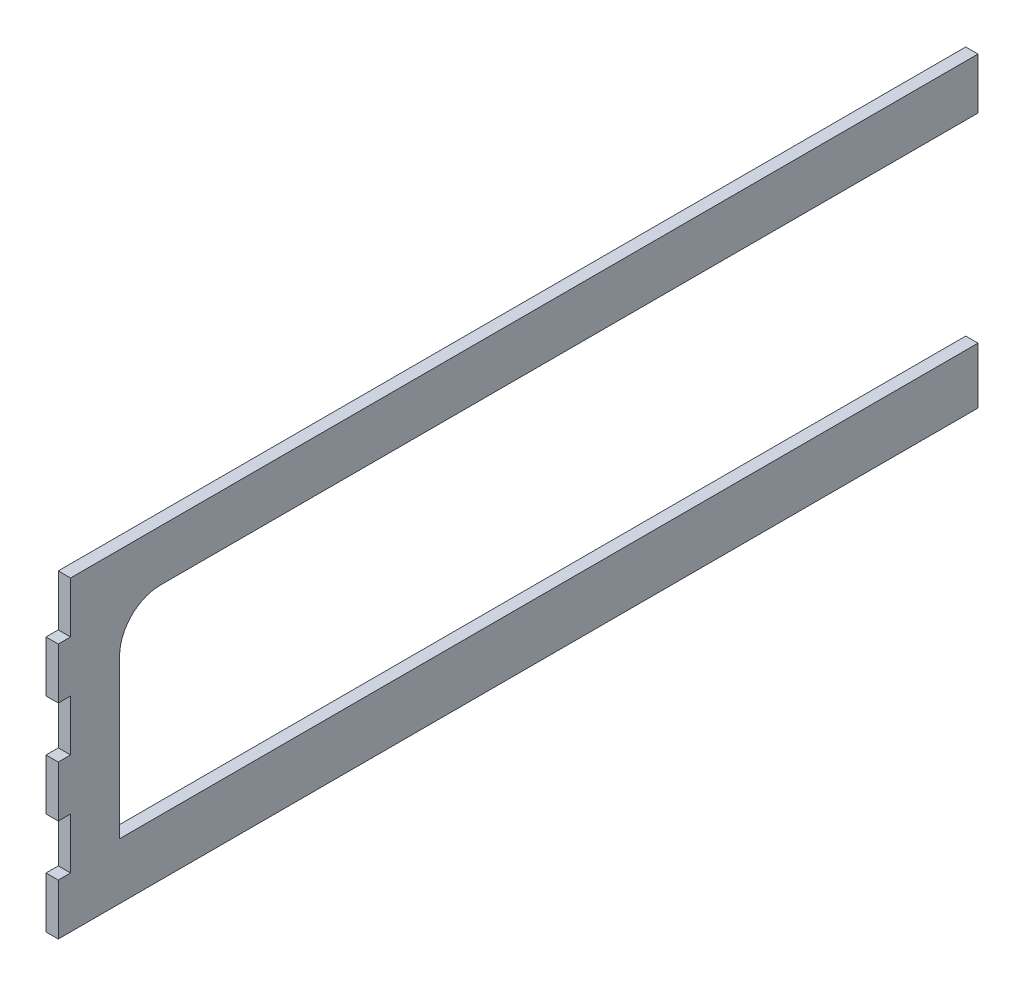
ISO-10303-21;
HEADER;
FILE_DESCRIPTION(('STEP AP214'),'2;1');
FILE_NAME('part.step','',(''),(''),'','','');
FILE_SCHEMA(('AUTOMOTIVE_DESIGN { 1 0 10303 214 1 1 1 1 }'));
ENDSEC;
DATA;
#1=APPLICATION_CONTEXT('core data for automotive mechanical design processes');
#2=APPLICATION_PROTOCOL_DEFINITION('international standard','automotive_design',2000,#1);
#3=PRODUCT_CONTEXT('',#1,'mechanical');
#4=PRODUCT('Part','Part','',(#3));
#5=PRODUCT_RELATED_PRODUCT_CATEGORY('part','',(#4));
#6=PRODUCT_DEFINITION_FORMATION('','',#4);
#7=PRODUCT_DEFINITION_CONTEXT('part definition',#1,'design');
#8=PRODUCT_DEFINITION('design','',#6,#7);
#9=PRODUCT_DEFINITION_SHAPE('','',#8);
#10=(LENGTH_UNIT() NAMED_UNIT(*) SI_UNIT(.MILLI.,.METRE.));
#11=(NAMED_UNIT(*) PLANE_ANGLE_UNIT() SI_UNIT($,.RADIAN.));
#12=(NAMED_UNIT(*) SI_UNIT($,.STERADIAN.) SOLID_ANGLE_UNIT());
#13=UNCERTAINTY_MEASURE_WITH_UNIT(LENGTH_MEASURE(1.E-05),#10,'distance_accuracy_value','');
#14=(GEOMETRIC_REPRESENTATION_CONTEXT(3) GLOBAL_UNCERTAINTY_ASSIGNED_CONTEXT((#13)) GLOBAL_UNIT_ASSIGNED_CONTEXT((#10,
#11,#12)) REPRESENTATION_CONTEXT('',''));
#15=CARTESIAN_POINT('',(0.,0.,0.));
#16=DIRECTION('',(0.,0.,1.));
#17=DIRECTION('',(1.,0.,0.));
#18=AXIS2_PLACEMENT_3D('',#15,#16,#17);
#19=CARTESIAN_POINT('',(6.,0.,0.));
#20=DIRECTION('',(0.,0.,-1.));
#21=DIRECTION('',(-1.,0.,0.));
#22=AXIS2_PLACEMENT_3D('',#19,#20,#21);
#23=PLANE('',#22);
#24=DIRECTION('',(0.,-1.,0.));
#25=VECTOR('',#24,1.);
#26=CARTESIAN_POINT('',(0.,0.,0.));
#27=LINE('',#26,#25);
#28=CARTESIAN_POINT('',(0.,125.,0.));
#29=VERTEX_POINT('',#28);
#30=CARTESIAN_POINT('',(0.,100.,0.));
#31=VERTEX_POINT('',#30);
#32=EDGE_CURVE('E207',#29,#31,#27,.T.);
#33=ORIENTED_EDGE('',*,*,#32,.T.);
#34=DIRECTION('',(1.,0.,0.));
#35=VECTOR('',#34,1.);
#36=CARTESIAN_POINT('',(0.,100.,0.));
#37=LINE('',#36,#35);
#38=CARTESIAN_POINT('',(6.,100.,0.));
#39=VERTEX_POINT('',#38);
#40=EDGE_CURVE('E319',#31,#39,#37,.T.);
#41=ORIENTED_EDGE('',*,*,#40,.T.);
#42=DIRECTION('',(0.,-1.,0.));
#43=VECTOR('',#42,1.);
#44=CARTESIAN_POINT('',(6.,0.,0.));
#45=LINE('',#44,#43);
#46=CARTESIAN_POINT('',(6.,125.,0.));
#47=VERTEX_POINT('',#46);
#48=EDGE_CURVE('E290',#47,#39,#45,.T.);
#49=ORIENTED_EDGE('',*,*,#48,.F.);
#50=DIRECTION('',(1.,0.,0.));
#51=VECTOR('',#50,1.);
#52=CARTESIAN_POINT('',(0.,125.,0.));
#53=LINE('',#52,#51);
#54=EDGE_CURVE('E301',#29,#47,#53,.T.);
#55=ORIENTED_EDGE('',*,*,#54,.F.);
#56=EDGE_LOOP('',(#33,#41,#49,#55));
#57=FACE_BOUND('',#56,.T.);
#58=ADVANCED_FACE('F44',(#57),#23,.F.);
#59=CARTESIAN_POINT('',(6.,75.,0.));
#60=VERTEX_POINT('',#59);
#61=CARTESIAN_POINT('',(6.,50.,0.));
#62=VERTEX_POINT('',#61);
#63=EDGE_CURVE('E196',#60,#62,#45,.T.);
#64=ORIENTED_EDGE('',*,*,#63,.F.);
#65=DIRECTION('',(1.,0.,0.));
#66=VECTOR('',#65,1.);
#67=CARTESIAN_POINT('',(0.,75.,0.));
#68=LINE('',#67,#66);
#69=CARTESIAN_POINT('',(0.,75.,0.));
#70=VERTEX_POINT('',#69);
#71=EDGE_CURVE('E180',#70,#60,#68,.T.);
#72=ORIENTED_EDGE('',*,*,#71,.F.);
#73=CARTESIAN_POINT('',(0.,50.,0.));
#74=VERTEX_POINT('',#73);
#75=EDGE_CURVE('E194',#70,#74,#27,.T.);
#76=ORIENTED_EDGE('',*,*,#75,.T.);
#77=DIRECTION('',(1.,0.,0.));
#78=VECTOR('',#77,1.);
#79=CARTESIAN_POINT('',(0.,50.,0.));
#80=LINE('',#79,#78);
#81=EDGE_CURVE('E335',#74,#62,#80,.T.);
#82=ORIENTED_EDGE('',*,*,#81,.T.);
#83=EDGE_LOOP('',(#64,#72,#76,#82));
#84=FACE_BOUND('',#83,.T.);
#85=ADVANCED_FACE('F192',(#84),#23,.F.);
#86=CARTESIAN_POINT('',(6.,25.,0.));
#87=VERTEX_POINT('',#86);
#88=CARTESIAN_POINT('',(6.,0.,0.));
#89=VERTEX_POINT('',#88);
#90=EDGE_CURVE('E240',#87,#89,#45,.T.);
#91=ORIENTED_EDGE('',*,*,#90,.F.);
#92=DIRECTION('',(1.,0.,0.));
#93=VECTOR('',#92,1.);
#94=CARTESIAN_POINT('',(0.,25.,0.));
#95=LINE('',#94,#93);
#96=CARTESIAN_POINT('',(0.,25.,0.));
#97=VERTEX_POINT('',#96);
#98=EDGE_CURVE('E326',#97,#87,#95,.T.);
#99=ORIENTED_EDGE('',*,*,#98,.F.);
#100=CARTESIAN_POINT('',(0.,0.,0.));
#101=VERTEX_POINT('',#100);
#102=EDGE_CURVE('E208',#97,#101,#27,.T.);
#103=ORIENTED_EDGE('',*,*,#102,.T.);
#104=DIRECTION('',(-1.,0.,0.));
#105=VECTOR('',#104,1.);
#106=CARTESIAN_POINT('',(6.,0.,0.));
#107=LINE('',#106,#105);
#108=EDGE_CURVE('E261',#89,#101,#107,.T.);
#109=ORIENTED_EDGE('',*,*,#108,.F.);
#110=EDGE_LOOP('',(#91,#99,#103,#109));
#111=FACE_BOUND('',#110,.T.);
#112=ADVANCED_FACE('F431',(#111),#23,.F.);
#113=CARTESIAN_POINT('',(6.,0.,0.));
#114=DIRECTION('',(0.,1.,0.));
#115=DIRECTION('',(0.,0.,1.));
#116=AXIS2_PLACEMENT_3D('',#113,#114,#115);
#117=PLANE('',#116);
#118=DIRECTION('',(0.,0.,-1.));
#119=VECTOR('',#118,1.);
#120=CARTESIAN_POINT('',(0.,0.,0.));
#121=LINE('',#120,#119);
#122=CARTESIAN_POINT('',(0.,0.,-450.));
#123=VERTEX_POINT('',#122);
#124=EDGE_CURVE('E213',#101,#123,#121,.T.);
#125=ORIENTED_EDGE('',*,*,#124,.T.);
#126=DIRECTION('',(-1.,0.,0.));
#127=VECTOR('',#126,1.);
#128=CARTESIAN_POINT('',(6.,0.,-450.));
#129=LINE('',#128,#127);
#130=CARTESIAN_POINT('',(6.,0.,-450.));
#131=VERTEX_POINT('',#130);
#132=EDGE_CURVE('E257',#131,#123,#129,.T.);
#133=ORIENTED_EDGE('',*,*,#132,.F.);
#134=DIRECTION('',(0.,0.,-1.));
#135=VECTOR('',#134,1.);
#136=CARTESIAN_POINT('',(6.,0.,0.));
#137=LINE('',#136,#135);
#138=EDGE_CURVE('E287',#89,#131,#137,.T.);
#139=ORIENTED_EDGE('',*,*,#138,.F.);
#140=ORIENTED_EDGE('',*,*,#108,.T.);
#141=EDGE_LOOP('',(#125,#133,#139,#140));
#142=FACE_BOUND('',#141,.T.);
#143=ADVANCED_FACE('F426',(#142),#117,.F.);
#144=CARTESIAN_POINT('',(6.,0.,-450.));
#145=DIRECTION('',(0.,0.,1.));
#146=DIRECTION('',(1.,0.,0.));
#147=AXIS2_PLACEMENT_3D('',#144,#145,#146);
#148=PLANE('',#147);
#149=DIRECTION('',(0.,1.,0.));
#150=VECTOR('',#149,1.);
#151=CARTESIAN_POINT('',(0.,0.,-450.));
#152=LINE('',#151,#150);
#153=CARTESIAN_POINT('',(0.,27.5,-450.));
#154=VERTEX_POINT('',#153);
#155=EDGE_CURVE('E221',#123,#154,#152,.T.);
#156=ORIENTED_EDGE('',*,*,#155,.T.);
#157=DIRECTION('',(-1.,0.,0.));
#158=VECTOR('',#157,1.);
#159=CARTESIAN_POINT('',(6.,27.5,-450.));
#160=LINE('',#159,#158);
#161=CARTESIAN_POINT('',(6.,27.5,-450.));
#162=VERTEX_POINT('',#161);
#163=EDGE_CURVE('E253',#162,#154,#160,.T.);
#164=ORIENTED_EDGE('',*,*,#163,.F.);
#165=DIRECTION('',(0.,1.,0.));
#166=VECTOR('',#165,1.);
#167=CARTESIAN_POINT('',(6.,0.,-450.));
#168=LINE('',#167,#166);
#169=EDGE_CURVE('E284',#131,#162,#168,.T.);
#170=ORIENTED_EDGE('',*,*,#169,.F.);
#171=ORIENTED_EDGE('',*,*,#132,.T.);
#172=EDGE_LOOP('',(#156,#164,#170,#171));
#173=FACE_BOUND('',#172,.T.);
#174=ADVANCED_FACE('F423',(#173),#148,.F.);
#175=CARTESIAN_POINT('',(6.,27.5,-450.));
#176=DIRECTION('',(0.,-1.,0.));
#177=DIRECTION('',(0.,0.,-1.));
#178=AXIS2_PLACEMENT_3D('',#175,#176,#177);
#179=PLANE('',#178);
#180=DIRECTION('',(0.,0.,1.));
#181=VECTOR('',#180,1.);
#182=CARTESIAN_POINT('',(0.,27.5,-450.));
#183=LINE('',#182,#181);
#184=CARTESIAN_POINT('',(0.,27.4999999999999,-30.));
#185=VERTEX_POINT('',#184);
#186=EDGE_CURVE('E224',#154,#185,#183,.T.);
#187=ORIENTED_EDGE('',*,*,#186,.T.);
#188=DIRECTION('',(-1.,0.,0.));
#189=VECTOR('',#188,1.);
#190=CARTESIAN_POINT('',(6.,27.4999999999999,-30.));
#191=LINE('',#190,#189);
#192=CARTESIAN_POINT('',(6.,27.4999999999999,-30.));
#193=VERTEX_POINT('',#192);
#194=EDGE_CURVE('E249',#193,#185,#191,.T.);
#195=ORIENTED_EDGE('',*,*,#194,.F.);
#196=DIRECTION('',(0.,0.,1.));
#197=VECTOR('',#196,1.);
#198=CARTESIAN_POINT('',(6.,27.5,-450.));
#199=LINE('',#198,#197);
#200=EDGE_CURVE('E281',#162,#193,#199,.T.);
#201=ORIENTED_EDGE('',*,*,#200,.F.);
#202=ORIENTED_EDGE('',*,*,#163,.T.);
#203=EDGE_LOOP('',(#187,#195,#201,#202));
#204=FACE_BOUND('',#203,.T.);
#205=ADVANCED_FACE('F419',(#204),#179,.F.);
#206=CARTESIAN_POINT('',(6.,125.,-30.));
#207=DIRECTION('',(0.,0.,1.));
#208=DIRECTION('',(1.,0.,0.));
#209=AXIS2_PLACEMENT_3D('',#206,#207,#208);
#210=PLANE('',#209);
#211=DIRECTION('',(0.,1.,0.));
#212=VECTOR('',#211,1.);
#213=CARTESIAN_POINT('',(0.,125.,-30.));
#214=LINE('',#213,#212);
#215=CARTESIAN_POINT('',(0.,105.,-30.));
#216=VERTEX_POINT('',#215);
#217=EDGE_CURVE('E227',#185,#216,#214,.T.);
#218=ORIENTED_EDGE('',*,*,#217,.T.);
#219=DIRECTION('',(-1.,0.,0.));
#220=VECTOR('',#219,1.);
#221=CARTESIAN_POINT('',(6.,105.,-30.));
#222=LINE('',#221,#220);
#223=CARTESIAN_POINT('',(6.,105.,-30.));
#224=VERTEX_POINT('',#223);
#225=EDGE_CURVE('E60',#216,#224,#222,.F.);
#226=ORIENTED_EDGE('',*,*,#225,.T.);
#227=DIRECTION('',(0.,1.,0.));
#228=VECTOR('',#227,1.);
#229=CARTESIAN_POINT('',(6.,125.,-30.));
#230=LINE('',#229,#228);
#231=EDGE_CURVE('E278',#193,#224,#230,.T.);
#232=ORIENTED_EDGE('',*,*,#231,.F.);
#233=ORIENTED_EDGE('',*,*,#194,.T.);
#234=EDGE_LOOP('',(#218,#226,#232,#233));
#235=FACE_BOUND('',#234,.T.);
#236=ADVANCED_FACE('F414',(#235),#210,.F.);
#237=CARTESIAN_POINT('',(6.,125.,-450.));
#238=DIRECTION('',(0.,1.,0.));
#239=DIRECTION('',(0.,0.,1.));
#240=AXIS2_PLACEMENT_3D('',#237,#238,#239);
#241=PLANE('',#240);
#242=DIRECTION('',(0.,0.,-1.));
#243=VECTOR('',#242,1.);
#244=CARTESIAN_POINT('',(6.,125.,-450.));
#245=LINE('',#244,#243);
#246=CARTESIAN_POINT('',(6.,125.,-50.));
#247=VERTEX_POINT('',#246);
#248=CARTESIAN_POINT('',(6.,125.,-450.));
#249=VERTEX_POINT('',#248);
#250=EDGE_CURVE('E276',#247,#249,#245,.T.);
#251=ORIENTED_EDGE('',*,*,#250,.F.);
#252=DIRECTION('',(-1.,0.,0.));
#253=VECTOR('',#252,1.);
#254=CARTESIAN_POINT('',(0.,125.,-50.));
#255=LINE('',#254,#253);
#256=CARTESIAN_POINT('',(0.,125.,-50.));
#257=VERTEX_POINT('',#256);
#258=EDGE_CURVE('E265',#247,#257,#255,.T.);
#259=ORIENTED_EDGE('',*,*,#258,.T.);
#260=DIRECTION('',(0.,0.,-1.));
#261=VECTOR('',#260,1.);
#262=CARTESIAN_POINT('',(0.,125.,-450.));
#263=LINE('',#262,#261);
#264=CARTESIAN_POINT('',(0.,125.,-450.));
#265=VERTEX_POINT('',#264);
#266=EDGE_CURVE('E230',#257,#265,#263,.T.);
#267=ORIENTED_EDGE('',*,*,#266,.T.);
#268=DIRECTION('',(-1.,0.,0.));
#269=VECTOR('',#268,1.);
#270=CARTESIAN_POINT('',(6.,125.,-450.));
#271=LINE('',#270,#269);
#272=EDGE_CURVE('E245',#249,#265,#271,.T.);
#273=ORIENTED_EDGE('',*,*,#272,.F.);
#274=EDGE_LOOP('',(#251,#259,#267,#273));
#275=FACE_BOUND('',#274,.T.);
#276=ADVANCED_FACE('F408',(#275),#241,.F.);
#277=CARTESIAN_POINT('',(6.,125.,-450.));
#278=DIRECTION('',(0.,0.,1.));
#279=DIRECTION('',(1.,0.,0.));
#280=AXIS2_PLACEMENT_3D('',#277,#278,#279);
#281=PLANE('',#280);
#282=DIRECTION('',(0.,1.,0.));
#283=VECTOR('',#282,1.);
#284=CARTESIAN_POINT('',(0.,125.,-450.));
#285=LINE('',#284,#283);
#286=CARTESIAN_POINT('',(0.,150.,-450.));
#287=VERTEX_POINT('',#286);
#288=EDGE_CURVE('E233',#265,#287,#285,.T.);
#289=ORIENTED_EDGE('',*,*,#288,.T.);
#290=DIRECTION('',(-1.,0.,0.));
#291=VECTOR('',#290,1.);
#292=CARTESIAN_POINT('',(6.,150.,-450.));
#293=LINE('',#292,#291);
#294=CARTESIAN_POINT('',(6.,150.,-450.));
#295=VERTEX_POINT('',#294);
#296=EDGE_CURVE('E241',#295,#287,#293,.T.);
#297=ORIENTED_EDGE('',*,*,#296,.F.);
#298=DIRECTION('',(0.,1.,0.));
#299=VECTOR('',#298,1.);
#300=CARTESIAN_POINT('',(6.,125.,-450.));
#301=LINE('',#300,#299);
#302=EDGE_CURVE('E274',#249,#295,#301,.T.);
#303=ORIENTED_EDGE('',*,*,#302,.F.);
#304=ORIENTED_EDGE('',*,*,#272,.T.);
#305=EDGE_LOOP('',(#289,#297,#303,#304));
#306=FACE_BOUND('',#305,.T.);
#307=ADVANCED_FACE('F404',(#306),#281,.F.);
#308=CARTESIAN_POINT('',(6.,150.,0.));
#309=DIRECTION('',(0.,-1.,0.));
#310=DIRECTION('',(0.,0.,-1.));
#311=AXIS2_PLACEMENT_3D('',#308,#309,#310);
#312=PLANE('',#311);
#313=DIRECTION('',(0.,0.,1.));
#314=VECTOR('',#313,1.);
#315=CARTESIAN_POINT('',(0.,150.,0.));
#316=LINE('',#315,#314);
#317=CARTESIAN_POINT('',(0.,150.,-6.));
#318=VERTEX_POINT('',#317);
#319=EDGE_CURVE('E236',#287,#318,#316,.T.);
#320=ORIENTED_EDGE('',*,*,#319,.T.);
#321=DIRECTION('',(1.,0.,0.));
#322=VECTOR('',#321,1.);
#323=CARTESIAN_POINT('',(0.,150.,-6.));
#324=LINE('',#323,#322);
#325=CARTESIAN_POINT('',(6.,150.,-6.));
#326=VERTEX_POINT('',#325);
#327=EDGE_CURVE('E214',#318,#326,#324,.T.);
#328=ORIENTED_EDGE('',*,*,#327,.T.);
#329=DIRECTION('',(0.,0.,1.));
#330=VECTOR('',#329,1.);
#331=CARTESIAN_POINT('',(6.,150.,0.));
#332=LINE('',#331,#330);
#333=EDGE_CURVE('E217',#295,#326,#332,.T.);
#334=ORIENTED_EDGE('',*,*,#333,.F.);
#335=ORIENTED_EDGE('',*,*,#296,.T.);
#336=EDGE_LOOP('',(#320,#328,#334,#335));
#337=FACE_BOUND('',#336,.T.);
#338=ADVANCED_FACE('F399',(#337),#312,.F.);
#339=CARTESIAN_POINT('',(6.,0.,0.));
#340=DIRECTION('',(-1.,0.,0.));
#341=DIRECTION('',(0.,0.,1.));
#342=AXIS2_PLACEMENT_3D('',#339,#340,#341);
#343=PLANE('',#342);
#344=ORIENTED_EDGE('',*,*,#48,.T.);
#345=DIRECTION('',(0.,0.,1.));
#346=VECTOR('',#345,1.);
#347=CARTESIAN_POINT('',(6.,100.,0.));
#348=LINE('',#347,#346);
#349=CARTESIAN_POINT('',(6.,100.,-6.));
#350=VERTEX_POINT('',#349);
#351=EDGE_CURVE('E187',#350,#39,#348,.T.);
#352=ORIENTED_EDGE('',*,*,#351,.F.);
#353=DIRECTION('',(0.,1.,0.));
#354=VECTOR('',#353,1.);
#355=CARTESIAN_POINT('',(6.,100.,-6.));
#356=LINE('',#355,#354);
#357=CARTESIAN_POINT('',(6.,75.,-6.));
#358=VERTEX_POINT('',#357);
#359=EDGE_CURVE('E369',#358,#350,#356,.T.);
#360=ORIENTED_EDGE('',*,*,#359,.F.);
#361=DIRECTION('',(0.,0.,-1.));
#362=VECTOR('',#361,1.);
#363=CARTESIAN_POINT('',(6.,75.,0.));
#364=LINE('',#363,#362);
#365=EDGE_CURVE('E338',#60,#358,#364,.T.);
#366=ORIENTED_EDGE('',*,*,#365,.F.);
#367=ORIENTED_EDGE('',*,*,#63,.T.);
#368=DIRECTION('',(0.,0.,1.));
#369=VECTOR('',#368,1.);
#370=CARTESIAN_POINT('',(6.,50.,0.));
#371=LINE('',#370,#369);
#372=CARTESIAN_POINT('',(6.,50.,-6.));
#373=VERTEX_POINT('',#372);
#374=EDGE_CURVE('E339',#373,#62,#371,.T.);
#375=ORIENTED_EDGE('',*,*,#374,.F.);
#376=DIRECTION('',(0.,1.,0.));
#377=VECTOR('',#376,1.);
#378=CARTESIAN_POINT('',(6.,50.,-6.));
#379=LINE('',#378,#377);
#380=CARTESIAN_POINT('',(6.,25.,-6.));
#381=VERTEX_POINT('',#380);
#382=EDGE_CURVE('E343',#381,#373,#379,.T.);
#383=ORIENTED_EDGE('',*,*,#382,.F.);
#384=DIRECTION('',(0.,0.,-1.));
#385=VECTOR('',#384,1.);
#386=CARTESIAN_POINT('',(6.,25.,0.));
#387=LINE('',#386,#385);
#388=EDGE_CURVE('E347',#87,#381,#387,.T.);
#389=ORIENTED_EDGE('',*,*,#388,.F.);
#390=ORIENTED_EDGE('',*,*,#90,.T.);
#391=ORIENTED_EDGE('',*,*,#138,.T.);
#392=ORIENTED_EDGE('',*,*,#169,.T.);
#393=ORIENTED_EDGE('',*,*,#200,.T.);
#394=ORIENTED_EDGE('',*,*,#231,.T.);
#395=CARTESIAN_POINT('',(6.,105.,-50.));
#396=DIRECTION('',(-1.,0.,0.));
#397=DIRECTION('',(0.,0.,1.));
#398=AXIS2_PLACEMENT_3D('',#395,#396,#397);
#399=CIRCLE('',#398,20.);
#400=EDGE_CURVE('E11',#224,#247,#399,.T.);
#401=ORIENTED_EDGE('',*,*,#400,.T.);
#402=ORIENTED_EDGE('',*,*,#250,.T.);
#403=ORIENTED_EDGE('',*,*,#302,.T.);
#404=ORIENTED_EDGE('',*,*,#333,.T.);
#405=DIRECTION('',(0.,1.,0.));
#406=VECTOR('',#405,1.);
#407=CARTESIAN_POINT('',(6.,150.,-6.));
#408=LINE('',#407,#406);
#409=CARTESIAN_POINT('',(6.,125.,-6.));
#410=VERTEX_POINT('',#409);
#411=EDGE_CURVE('E311',#410,#326,#408,.T.);
#412=ORIENTED_EDGE('',*,*,#411,.F.);
#413=DIRECTION('',(0.,0.,-1.));
#414=VECTOR('',#413,1.);
#415=CARTESIAN_POINT('',(6.,125.,0.));
#416=LINE('',#415,#414);
#417=EDGE_CURVE('E315',#47,#410,#416,.T.);
#418=ORIENTED_EDGE('',*,*,#417,.F.);
#419=EDGE_LOOP('',(#344,#352,#360,#366,#367,#375,#383,#389,#390,#391,#392,#393,#394,#401,#402,
#403,#404,#412,#418));
#420=FACE_BOUND('',#419,.T.);
#421=ADVANCED_FACE('F390',(#420),#343,.F.);
#422=CARTESIAN_POINT('',(0.,0.,0.));
#423=DIRECTION('',(-1.,0.,0.));
#424=DIRECTION('',(0.,0.,1.));
#425=AXIS2_PLACEMENT_3D('',#422,#423,#424);
#426=PLANE('',#425);
#427=DIRECTION('',(0.,0.,1.));
#428=VECTOR('',#427,1.);
#429=CARTESIAN_POINT('',(0.,100.,0.));
#430=LINE('',#429,#428);
#431=CARTESIAN_POINT('',(0.,100.,-6.));
#432=VERTEX_POINT('',#431);
#433=EDGE_CURVE('E198',#432,#31,#430,.T.);
#434=ORIENTED_EDGE('',*,*,#433,.T.);
#435=ORIENTED_EDGE('',*,*,#32,.F.);
#436=DIRECTION('',(0.,0.,-1.));
#437=VECTOR('',#436,1.);
#438=CARTESIAN_POINT('',(0.,125.,0.));
#439=LINE('',#438,#437);
#440=CARTESIAN_POINT('',(0.,125.,-6.));
#441=VERTEX_POINT('',#440);
#442=EDGE_CURVE('E314',#29,#441,#439,.T.);
#443=ORIENTED_EDGE('',*,*,#442,.T.);
#444=DIRECTION('',(0.,1.,0.));
#445=VECTOR('',#444,1.);
#446=CARTESIAN_POINT('',(0.,150.,-6.));
#447=LINE('',#446,#445);
#448=EDGE_CURVE('E305',#441,#318,#447,.T.);
#449=ORIENTED_EDGE('',*,*,#448,.T.);
#450=ORIENTED_EDGE('',*,*,#319,.F.);
#451=ORIENTED_EDGE('',*,*,#288,.F.);
#452=ORIENTED_EDGE('',*,*,#266,.F.);
#453=CARTESIAN_POINT('',(0.,105.,-50.));
#454=DIRECTION('',(-1.,0.,0.));
#455=DIRECTION('',(0.,0.,1.));
#456=AXIS2_PLACEMENT_3D('',#453,#454,#455);
#457=CIRCLE('',#456,20.);
#458=EDGE_CURVE('E53',#257,#216,#457,.F.);
#459=ORIENTED_EDGE('',*,*,#458,.T.);
#460=ORIENTED_EDGE('',*,*,#217,.F.);
#461=ORIENTED_EDGE('',*,*,#186,.F.);
#462=ORIENTED_EDGE('',*,*,#155,.F.);
#463=ORIENTED_EDGE('',*,*,#124,.F.);
#464=ORIENTED_EDGE('',*,*,#102,.F.);
#465=DIRECTION('',(0.,0.,-1.));
#466=VECTOR('',#465,1.);
#467=CARTESIAN_POINT('',(0.,25.,0.));
#468=LINE('',#467,#466);
#469=CARTESIAN_POINT('',(0.,25.,-6.));
#470=VERTEX_POINT('',#469);
#471=EDGE_CURVE('E342',#97,#470,#468,.T.);
#472=ORIENTED_EDGE('',*,*,#471,.T.);
#473=DIRECTION('',(0.,1.,0.));
#474=VECTOR('',#473,1.);
#475=CARTESIAN_POINT('',(0.,50.,-6.));
#476=LINE('',#475,#474);
#477=CARTESIAN_POINT('',(0.,50.,-6.));
#478=VERTEX_POINT('',#477);
#479=EDGE_CURVE('E353',#470,#478,#476,.T.);
#480=ORIENTED_EDGE('',*,*,#479,.T.);
#481=DIRECTION('',(0.,0.,1.));
#482=VECTOR('',#481,1.);
#483=CARTESIAN_POINT('',(0.,50.,0.));
#484=LINE('',#483,#482);
#485=EDGE_CURVE('E205',#478,#74,#484,.T.);
#486=ORIENTED_EDGE('',*,*,#485,.T.);
#487=ORIENTED_EDGE('',*,*,#75,.F.);
#488=DIRECTION('',(0.,0.,-1.));
#489=VECTOR('',#488,1.);
#490=CARTESIAN_POINT('',(0.,75.,0.));
#491=LINE('',#490,#489);
#492=CARTESIAN_POINT('',(0.,75.,-6.));
#493=VERTEX_POINT('',#492);
#494=EDGE_CURVE('E176',#70,#493,#491,.T.);
#495=ORIENTED_EDGE('',*,*,#494,.T.);
#496=DIRECTION('',(0.,1.,0.));
#497=VECTOR('',#496,1.);
#498=CARTESIAN_POINT('',(0.,100.,-6.));
#499=LINE('',#498,#497);
#500=EDGE_CURVE('E186',#493,#432,#499,.T.);
#501=ORIENTED_EDGE('',*,*,#500,.T.);
#502=EDGE_LOOP('',(#434,#435,#443,#449,#450,#451,#452,#459,#460,#461,#462,#463,#464,#472,#480,
#486,#487,#495,#501));
#503=FACE_BOUND('',#502,.T.);
#504=ADVANCED_FACE('F202',(#503),#426,.T.);
#505=CARTESIAN_POINT('',(0.,150.,-6.));
#506=DIRECTION('',(0.,0.,-1.));
#507=DIRECTION('',(0.,1.,0.));
#508=AXIS2_PLACEMENT_3D('',#505,#506,#507);
#509=PLANE('',#508);
#510=ORIENTED_EDGE('',*,*,#411,.T.);
#511=ORIENTED_EDGE('',*,*,#327,.F.);
#512=ORIENTED_EDGE('',*,*,#448,.F.);
#513=DIRECTION('',(1.,0.,0.));
#514=VECTOR('',#513,1.);
#515=CARTESIAN_POINT('',(0.,125.,-6.));
#516=LINE('',#515,#514);
#517=EDGE_CURVE('E304',#441,#410,#516,.T.);
#518=ORIENTED_EDGE('',*,*,#517,.T.);
#519=EDGE_LOOP('',(#510,#511,#512,#518));
#520=FACE_BOUND('',#519,.T.);
#521=ADVANCED_FACE('F448',(#520),#509,.F.);
#522=CARTESIAN_POINT('',(0.,125.,0.));
#523=DIRECTION('',(0.,-1.,0.));
#524=DIRECTION('',(0.,0.,-1.));
#525=AXIS2_PLACEMENT_3D('',#522,#523,#524);
#526=PLANE('',#525);
#527=ORIENTED_EDGE('',*,*,#417,.T.);
#528=ORIENTED_EDGE('',*,*,#517,.F.);
#529=ORIENTED_EDGE('',*,*,#442,.F.);
#530=ORIENTED_EDGE('',*,*,#54,.T.);
#531=EDGE_LOOP('',(#527,#528,#529,#530));
#532=FACE_BOUND('',#531,.T.);
#533=ADVANCED_FACE('F394',(#532),#526,.F.);
#534=CARTESIAN_POINT('',(0.,50.,0.));
#535=DIRECTION('',(0.,1.,0.));
#536=DIRECTION('',(0.,0.,1.));
#537=AXIS2_PLACEMENT_3D('',#534,#535,#536);
#538=PLANE('',#537);
#539=ORIENTED_EDGE('',*,*,#374,.T.);
#540=ORIENTED_EDGE('',*,*,#81,.F.);
#541=ORIENTED_EDGE('',*,*,#485,.F.);
#542=DIRECTION('',(1.,0.,0.));
#543=VECTOR('',#542,1.);
#544=CARTESIAN_POINT('',(0.,50.,-6.));
#545=LINE('',#544,#543);
#546=EDGE_CURVE('E332',#478,#373,#545,.T.);
#547=ORIENTED_EDGE('',*,*,#546,.T.);
#548=EDGE_LOOP('',(#539,#540,#541,#547));
#549=FACE_BOUND('',#548,.T.);
#550=ADVANCED_FACE('F440',(#549),#538,.F.);
#551=CARTESIAN_POINT('',(0.,50.,-6.));
#552=DIRECTION('',(0.,0.,-1.));
#553=DIRECTION('',(0.,1.,0.));
#554=AXIS2_PLACEMENT_3D('',#551,#552,#553);
#555=PLANE('',#554);
#556=ORIENTED_EDGE('',*,*,#382,.T.);
#557=ORIENTED_EDGE('',*,*,#546,.F.);
#558=ORIENTED_EDGE('',*,*,#479,.F.);
#559=DIRECTION('',(1.,0.,0.));
#560=VECTOR('',#559,1.);
#561=CARTESIAN_POINT('',(0.,25.,-6.));
#562=LINE('',#561,#560);
#563=EDGE_CURVE('E329',#470,#381,#562,.T.);
#564=ORIENTED_EDGE('',*,*,#563,.T.);
#565=EDGE_LOOP('',(#556,#557,#558,#564));
#566=FACE_BOUND('',#565,.T.);
#567=ADVANCED_FACE('F438',(#566),#555,.F.);
#568=CARTESIAN_POINT('',(0.,25.,0.));
#569=DIRECTION('',(0.,-1.,0.));
#570=DIRECTION('',(0.,0.,-1.));
#571=AXIS2_PLACEMENT_3D('',#568,#569,#570);
#572=PLANE('',#571);
#573=ORIENTED_EDGE('',*,*,#388,.T.);
#574=ORIENTED_EDGE('',*,*,#563,.F.);
#575=ORIENTED_EDGE('',*,*,#471,.F.);
#576=ORIENTED_EDGE('',*,*,#98,.T.);
#577=EDGE_LOOP('',(#573,#574,#575,#576));
#578=FACE_BOUND('',#577,.T.);
#579=ADVANCED_FACE('F433',(#578),#572,.F.);
#580=CARTESIAN_POINT('',(0.,100.,0.));
#581=DIRECTION('',(0.,1.,0.));
#582=DIRECTION('',(0.,0.,1.));
#583=AXIS2_PLACEMENT_3D('',#580,#581,#582);
#584=PLANE('',#583);
#585=ORIENTED_EDGE('',*,*,#351,.T.);
#586=ORIENTED_EDGE('',*,*,#40,.F.);
#587=ORIENTED_EDGE('',*,*,#433,.F.);
#588=DIRECTION('',(1.,0.,0.));
#589=VECTOR('',#588,1.);
#590=CARTESIAN_POINT('',(0.,100.,-6.));
#591=LINE('',#590,#589);
#592=EDGE_CURVE('E361',#432,#350,#591,.T.);
#593=ORIENTED_EDGE('',*,*,#592,.T.);
#594=EDGE_LOOP('',(#585,#586,#587,#593));
#595=FACE_BOUND('',#594,.T.);
#596=ADVANCED_FACE('F385',(#595),#584,.F.);
#597=CARTESIAN_POINT('',(0.,100.,-6.));
#598=DIRECTION('',(0.,0.,-1.));
#599=DIRECTION('',(0.,1.,0.));
#600=AXIS2_PLACEMENT_3D('',#597,#598,#599);
#601=PLANE('',#600);
#602=ORIENTED_EDGE('',*,*,#359,.T.);
#603=ORIENTED_EDGE('',*,*,#592,.F.);
#604=ORIENTED_EDGE('',*,*,#500,.F.);
#605=DIRECTION('',(1.,0.,0.));
#606=VECTOR('',#605,1.);
#607=CARTESIAN_POINT('',(0.,75.,-6.));
#608=LINE('',#607,#606);
#609=EDGE_CURVE('E182',#493,#358,#608,.T.);
#610=ORIENTED_EDGE('',*,*,#609,.T.);
#611=EDGE_LOOP('',(#602,#603,#604,#610));
#612=FACE_BOUND('',#611,.T.);
#613=ADVANCED_FACE('F381',(#612),#601,.F.);
#614=CARTESIAN_POINT('',(0.,75.,0.));
#615=DIRECTION('',(0.,-1.,0.));
#616=DIRECTION('',(0.,0.,-1.));
#617=AXIS2_PLACEMENT_3D('',#614,#615,#616);
#618=PLANE('',#617);
#619=ORIENTED_EDGE('',*,*,#365,.T.);
#620=ORIENTED_EDGE('',*,*,#609,.F.);
#621=ORIENTED_EDGE('',*,*,#494,.F.);
#622=ORIENTED_EDGE('',*,*,#71,.T.);
#623=EDGE_LOOP('',(#619,#620,#621,#622));
#624=FACE_BOUND('',#623,.T.);
#625=ADVANCED_FACE('F179',(#624),#618,.F.);
#626=CARTESIAN_POINT('',(6.,105.,-50.));
#627=DIRECTION('',(1.,0.,0.));
#628=DIRECTION('',(0.,0.,-1.));
#629=AXIS2_PLACEMENT_3D('',#626,#627,#628);
#630=CYLINDRICAL_SURFACE('',#629,20.);
#631=ORIENTED_EDGE('',*,*,#400,.F.);
#632=ORIENTED_EDGE('',*,*,#225,.F.);
#633=ORIENTED_EDGE('',*,*,#458,.F.);
#634=ORIENTED_EDGE('',*,*,#258,.F.);
#635=EDGE_LOOP('',(#631,#632,#633,#634));
#636=FACE_BOUND('',#635,.T.);
#637=ADVANCED_FACE('F46',(#636),#630,.F.);
#638=CLOSED_SHELL('',(#58,#85,#112,#143,#174,#205,#236,#276,#307,#338,#421,#504,#521,#533,#550,
#567,#579,#596,#613,#625,#637));
#639=MANIFOLD_SOLID_BREP('B2',#638);
#640=ADVANCED_BREP_SHAPE_REPRESENTATION('',(#18,#639),#14);
#641=SHAPE_DEFINITION_REPRESENTATION(#9,#640);
ENDSEC;
END-ISO-10303-21;
